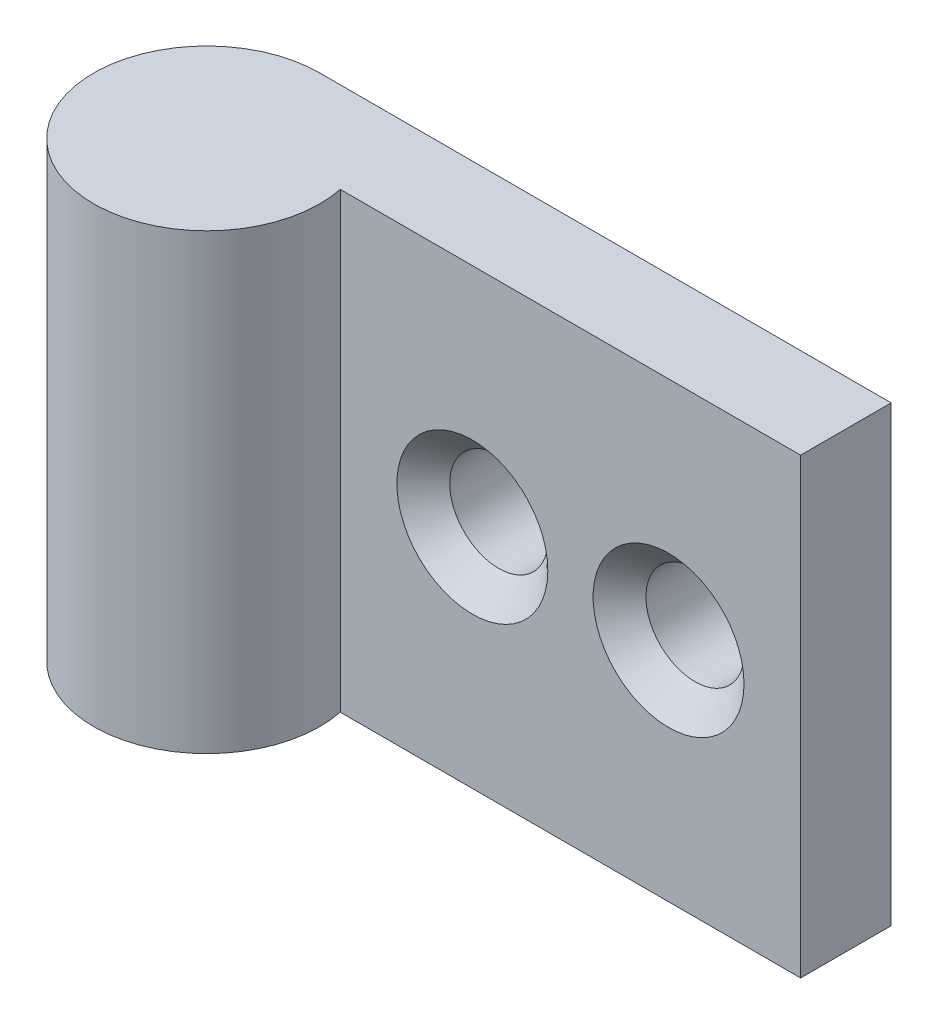
ISO-10303-21;
HEADER;
FILE_DESCRIPTION(('STEP AP214'),'2;1');
FILE_NAME('part.step','',(''),(''),'','','');
FILE_SCHEMA(('AUTOMOTIVE_DESIGN { 1 0 10303 214 1 1 1 1 }'));
ENDSEC;
DATA;
#1=APPLICATION_CONTEXT('core data for automotive mechanical design processes');
#2=APPLICATION_PROTOCOL_DEFINITION('international standard','automotive_design',2000,#1);
#3=PRODUCT_CONTEXT('',#1,'mechanical');
#4=PRODUCT('Part','Part','',(#3));
#5=PRODUCT_RELATED_PRODUCT_CATEGORY('part','',(#4));
#6=PRODUCT_DEFINITION_FORMATION('','',#4);
#7=PRODUCT_DEFINITION_CONTEXT('part definition',#1,'design');
#8=PRODUCT_DEFINITION('design','',#6,#7);
#9=PRODUCT_DEFINITION_SHAPE('','',#8);
#10=(LENGTH_UNIT() NAMED_UNIT(*) SI_UNIT(.MILLI.,.METRE.));
#11=(NAMED_UNIT(*) PLANE_ANGLE_UNIT() SI_UNIT($,.RADIAN.));
#12=(NAMED_UNIT(*) SI_UNIT($,.STERADIAN.) SOLID_ANGLE_UNIT());
#13=UNCERTAINTY_MEASURE_WITH_UNIT(LENGTH_MEASURE(1.E-05),#10,'distance_accuracy_value','');
#14=(GEOMETRIC_REPRESENTATION_CONTEXT(3) GLOBAL_UNCERTAINTY_ASSIGNED_CONTEXT((#13)) GLOBAL_UNIT_ASSIGNED_CONTEXT((#10,
#11,#12)) REPRESENTATION_CONTEXT('',''));
#15=CARTESIAN_POINT('',(0.,0.,0.));
#16=DIRECTION('',(0.,0.,1.));
#17=DIRECTION('',(1.,0.,0.));
#18=AXIS2_PLACEMENT_3D('',#15,#16,#17);
#19=CARTESIAN_POINT('',(30.5,-30.,6.));
#20=DIRECTION('',(0.,1.,0.));
#21=DIRECTION('',(0.,0.,1.));
#22=AXIS2_PLACEMENT_3D('',#19,#20,#21);
#23=PLANE('',#22);
#24=DIRECTION('',(1.,0.,0.));
#25=VECTOR('',#24,1.);
#26=CARTESIAN_POINT('',(30.5,-30.,0.));
#27=LINE('',#26,#25);
#28=CARTESIAN_POINT('',(-7.34846922834953,-30.,0.));
#29=VERTEX_POINT('',#28);
#30=CARTESIAN_POINT('',(30.5,-30.,0.));
#31=VERTEX_POINT('',#30);
#32=EDGE_CURVE('E66',#29,#31,#27,.T.);
#33=ORIENTED_EDGE('',*,*,#32,.T.);
#34=DIRECTION('',(0.,0.,-1.));
#35=VECTOR('',#34,1.);
#36=CARTESIAN_POINT('',(30.5,-30.,6.));
#37=LINE('',#36,#35);
#38=CARTESIAN_POINT('',(30.5,-30.,6.));
#39=VERTEX_POINT('',#38);
#40=EDGE_CURVE('E11',#39,#31,#37,.T.);
#41=ORIENTED_EDGE('',*,*,#40,.F.);
#42=DIRECTION('',(1.,0.,0.));
#43=VECTOR('',#42,1.);
#44=CARTESIAN_POINT('',(30.5,-30.,6.));
#45=LINE('',#44,#43);
#46=CARTESIAN_POINT('',(0.,-30.,6.));
#47=VERTEX_POINT('',#46);
#48=EDGE_CURVE('E81',#47,#39,#45,.T.);
#49=ORIENTED_EDGE('',*,*,#48,.F.);
#50=CARTESIAN_POINT('',(-7.34846922834953,-30.,7.5));
#51=DIRECTION('',(0.,-1.,0.));
#52=DIRECTION('',(0.,0.,-1.));
#53=AXIS2_PLACEMENT_3D('',#50,#51,#52);
#54=CIRCLE('',#53,7.5);
#55=EDGE_CURVE('E109',#47,#29,#54,.T.);
#56=ORIENTED_EDGE('',*,*,#55,.T.);
#57=EDGE_LOOP('',(#33,#41,#49,#56));
#58=FACE_BOUND('',#57,.T.);
#59=ADVANCED_FACE('F38',(#58),#23,.F.);
#60=CARTESIAN_POINT('',(30.5,0.,6.));
#61=DIRECTION('',(-1.,0.,0.));
#62=DIRECTION('',(0.,0.,1.));
#63=AXIS2_PLACEMENT_3D('',#60,#61,#62);
#64=PLANE('',#63);
#65=DIRECTION('',(0.,1.,0.));
#66=VECTOR('',#65,1.);
#67=CARTESIAN_POINT('',(30.5,0.,0.));
#68=LINE('',#67,#66);
#69=CARTESIAN_POINT('',(30.5,0.,0.));
#70=VERTEX_POINT('',#69);
#71=EDGE_CURVE('E98',#31,#70,#68,.T.);
#72=ORIENTED_EDGE('',*,*,#71,.T.);
#73=DIRECTION('',(0.,0.,-1.));
#74=VECTOR('',#73,1.);
#75=CARTESIAN_POINT('',(30.5,0.,6.));
#76=LINE('',#75,#74);
#77=CARTESIAN_POINT('',(30.5,0.,6.));
#78=VERTEX_POINT('',#77);
#79=EDGE_CURVE('E46',#78,#70,#76,.T.);
#80=ORIENTED_EDGE('',*,*,#79,.F.);
#81=DIRECTION('',(0.,1.,0.));
#82=VECTOR('',#81,1.);
#83=CARTESIAN_POINT('',(30.5,0.,6.));
#84=LINE('',#83,#82);
#85=EDGE_CURVE('E84',#39,#78,#84,.T.);
#86=ORIENTED_EDGE('',*,*,#85,.F.);
#87=ORIENTED_EDGE('',*,*,#40,.T.);
#88=EDGE_LOOP('',(#72,#80,#86,#87));
#89=FACE_BOUND('',#88,.T.);
#90=ADVANCED_FACE('F92',(#89),#64,.F.);
#91=CARTESIAN_POINT('',(0.,0.,6.));
#92=DIRECTION('',(0.,-1.,0.));
#93=DIRECTION('',(0.,0.,-1.));
#94=AXIS2_PLACEMENT_3D('',#91,#92,#93);
#95=PLANE('',#94);
#96=DIRECTION('',(-1.,0.,0.));
#97=VECTOR('',#96,1.);
#98=CARTESIAN_POINT('',(0.,0.,0.));
#99=LINE('',#98,#97);
#100=CARTESIAN_POINT('',(-7.34846922834953,0.,0.));
#101=VERTEX_POINT('',#100);
#102=EDGE_CURVE('E75',#70,#101,#99,.T.);
#103=ORIENTED_EDGE('',*,*,#102,.T.);
#104=CARTESIAN_POINT('',(-7.34846922834953,0.,7.5));
#105=DIRECTION('',(0.,-1.,0.));
#106=DIRECTION('',(0.,0.,-1.));
#107=AXIS2_PLACEMENT_3D('',#104,#105,#106);
#108=CIRCLE('',#107,7.5);
#109=CARTESIAN_POINT('',(0.,0.,6.));
#110=VERTEX_POINT('',#109);
#111=EDGE_CURVE('E108',#101,#110,#108,.F.);
#112=ORIENTED_EDGE('',*,*,#111,.T.);
#113=DIRECTION('',(-1.,0.,0.));
#114=VECTOR('',#113,1.);
#115=CARTESIAN_POINT('',(0.,0.,6.));
#116=LINE('',#115,#114);
#117=EDGE_CURVE('E54',#78,#110,#116,.T.);
#118=ORIENTED_EDGE('',*,*,#117,.F.);
#119=ORIENTED_EDGE('',*,*,#79,.T.);
#120=EDGE_LOOP('',(#103,#112,#118,#119));
#121=FACE_BOUND('',#120,.T.);
#122=ADVANCED_FACE('F101',(#121),#95,.F.);
#123=CARTESIAN_POINT('',(0.,0.,6.));
#124=DIRECTION('',(0.,0.,-1.));
#125=DIRECTION('',(-1.,0.,0.));
#126=AXIS2_PLACEMENT_3D('',#123,#124,#125);
#127=PLANE('',#126);
#128=CARTESIAN_POINT('',(8.75000000000001,-15.,6.));
#129=DIRECTION('',(0.,0.,1.));
#130=DIRECTION('',(1.,0.,0.));
#131=AXIS2_PLACEMENT_3D('',#128,#129,#130);
#132=CIRCLE('',#131,5.);
#133=CARTESIAN_POINT('',(13.75,-15.,6.));
#134=VERTEX_POINT('',#133);
#135=EDGE_CURVE('E111',#134,#134,#132,.T.);
#136=ORIENTED_EDGE('',*,*,#135,.F.);
#137=EDGE_LOOP('',(#136));
#138=FACE_BOUND('',#137,.T.);
#139=CARTESIAN_POINT('',(21.75,-15.,6.));
#140=DIRECTION('',(0.,0.,1.));
#141=DIRECTION('',(1.,0.,0.));
#142=AXIS2_PLACEMENT_3D('',#139,#140,#141);
#143=CIRCLE('',#142,5.);
#144=CARTESIAN_POINT('',(26.75,-15.,6.));
#145=VERTEX_POINT('',#144);
#146=EDGE_CURVE('E123',#145,#145,#143,.T.);
#147=ORIENTED_EDGE('',*,*,#146,.F.);
#148=EDGE_LOOP('',(#147));
#149=FACE_BOUND('',#148,.T.);
#150=DIRECTION('',(0.,-1.,0.));
#151=VECTOR('',#150,1.);
#152=CARTESIAN_POINT('',(0.,-30.,6.));
#153=LINE('',#152,#151);
#154=EDGE_CURVE('E87',#110,#47,#153,.T.);
#155=ORIENTED_EDGE('',*,*,#154,.T.);
#156=ORIENTED_EDGE('',*,*,#48,.T.);
#157=ORIENTED_EDGE('',*,*,#85,.T.);
#158=ORIENTED_EDGE('',*,*,#117,.T.);
#159=EDGE_LOOP('',(#155,#156,#157,#158));
#160=FACE_BOUND('',#159,.T.);
#161=ADVANCED_FACE('F82',(#138,#149,#160),#127,.F.);
#162=CARTESIAN_POINT('',(0.,0.,0.));
#163=DIRECTION('',(0.,0.,-1.));
#164=DIRECTION('',(-1.,0.,0.));
#165=AXIS2_PLACEMENT_3D('',#162,#163,#164);
#166=PLANE('',#165);
#167=CARTESIAN_POINT('',(8.75000000000001,-15.,0.));
#168=DIRECTION('',(0.,0.,1.));
#169=DIRECTION('',(1.,0.,0.));
#170=AXIS2_PLACEMENT_3D('',#167,#168,#169);
#171=CIRCLE('',#170,3.25);
#172=CARTESIAN_POINT('',(12.,-15.,0.));
#173=VERTEX_POINT('',#172);
#174=EDGE_CURVE('E120',#173,#173,#171,.T.);
#175=ORIENTED_EDGE('',*,*,#174,.T.);
#176=EDGE_LOOP('',(#175));
#177=FACE_BOUND('',#176,.T.);
#178=CARTESIAN_POINT('',(21.75,-15.,0.));
#179=DIRECTION('',(0.,0.,1.));
#180=DIRECTION('',(1.,0.,0.));
#181=AXIS2_PLACEMENT_3D('',#178,#179,#180);
#182=CIRCLE('',#181,3.25);
#183=CARTESIAN_POINT('',(25.,-15.,0.));
#184=VERTEX_POINT('',#183);
#185=EDGE_CURVE('E99',#184,#184,#182,.T.);
#186=ORIENTED_EDGE('',*,*,#185,.T.);
#187=EDGE_LOOP('',(#186));
#188=FACE_BOUND('',#187,.T.);
#189=ORIENTED_EDGE('',*,*,#32,.F.);
#190=DIRECTION('',(0.,-1.,0.));
#191=VECTOR('',#190,1.);
#192=CARTESIAN_POINT('',(-7.34846922834953,21.2132034355964,0.));
#193=LINE('',#192,#191);
#194=EDGE_CURVE('E106',#101,#29,#193,.T.);
#195=ORIENTED_EDGE('',*,*,#194,.F.);
#196=ORIENTED_EDGE('',*,*,#102,.F.);
#197=ORIENTED_EDGE('',*,*,#71,.F.);
#198=EDGE_LOOP('',(#189,#195,#196,#197));
#199=FACE_BOUND('',#198,.T.);
#200=ADVANCED_FACE('F104',(#177,#188,#199),#166,.T.);
#201=CARTESIAN_POINT('',(21.75,-15.,6.));
#202=DIRECTION('',(0.,0.,1.));
#203=DIRECTION('',(1.,0.,0.));
#204=AXIS2_PLACEMENT_3D('',#201,#202,#203);
#205=CYLINDRICAL_SURFACE('',#204,3.25);
#206=ORIENTED_EDGE('',*,*,#185,.F.);
#207=EDGE_LOOP('',(#206));
#208=FACE_BOUND('',#207,.T.);
#209=CARTESIAN_POINT('',(21.75,-15.,4.25));
#210=DIRECTION('',(0.,0.,1.));
#211=DIRECTION('',(1.,0.,0.));
#212=AXIS2_PLACEMENT_3D('',#209,#210,#211);
#213=CIRCLE('',#212,3.25);
#214=CARTESIAN_POINT('',(25.,-15.,4.25));
#215=VERTEX_POINT('',#214);
#216=EDGE_CURVE('E126',#215,#215,#213,.T.);
#217=ORIENTED_EDGE('',*,*,#216,.T.);
#218=EDGE_LOOP('',(#217));
#219=FACE_BOUND('',#218,.T.);
#220=ADVANCED_FACE('F133',(#208,#219),#205,.F.);
#221=CARTESIAN_POINT('',(21.75,-15.,6.));
#222=DIRECTION('',(0.,0.,1.));
#223=DIRECTION('',(1.,0.,0.));
#224=AXIS2_PLACEMENT_3D('',#221,#222,#223);
#225=CONICAL_SURFACE('',#224,5.,0.78539816339745);
#226=ORIENTED_EDGE('',*,*,#216,.F.);
#227=EDGE_LOOP('',(#226));
#228=FACE_BOUND('',#227,.T.);
#229=ORIENTED_EDGE('',*,*,#146,.T.);
#230=EDGE_LOOP('',(#229));
#231=FACE_BOUND('',#230,.T.);
#232=ADVANCED_FACE('F136',(#228,#231),#225,.F.);
#233=CARTESIAN_POINT('',(8.75000000000001,-15.,6.));
#234=DIRECTION('',(0.,0.,1.));
#235=DIRECTION('',(1.,0.,0.));
#236=AXIS2_PLACEMENT_3D('',#233,#234,#235);
#237=CYLINDRICAL_SURFACE('',#236,3.25);
#238=ORIENTED_EDGE('',*,*,#174,.F.);
#239=EDGE_LOOP('',(#238));
#240=FACE_BOUND('',#239,.T.);
#241=CARTESIAN_POINT('',(8.75000000000001,-15.,4.25));
#242=DIRECTION('',(0.,0.,1.));
#243=DIRECTION('',(1.,0.,0.));
#244=AXIS2_PLACEMENT_3D('',#241,#242,#243);
#245=CIRCLE('',#244,3.25);
#246=CARTESIAN_POINT('',(12.,-15.,4.25));
#247=VERTEX_POINT('',#246);
#248=EDGE_CURVE('E117',#247,#247,#245,.T.);
#249=ORIENTED_EDGE('',*,*,#248,.T.);
#250=EDGE_LOOP('',(#249));
#251=FACE_BOUND('',#250,.T.);
#252=ADVANCED_FACE('F142',(#240,#251),#237,.F.);
#253=CARTESIAN_POINT('',(8.75000000000001,-15.,6.));
#254=DIRECTION('',(0.,0.,1.));
#255=DIRECTION('',(1.,0.,0.));
#256=AXIS2_PLACEMENT_3D('',#253,#254,#255);
#257=CONICAL_SURFACE('',#256,5.,0.78539816339745);
#258=ORIENTED_EDGE('',*,*,#248,.F.);
#259=EDGE_LOOP('',(#258));
#260=FACE_BOUND('',#259,.T.);
#261=ORIENTED_EDGE('',*,*,#135,.T.);
#262=EDGE_LOOP('',(#261));
#263=FACE_BOUND('',#262,.T.);
#264=ADVANCED_FACE('F192',(#260,#263),#257,.F.);
#265=CARTESIAN_POINT('',(-7.34846922834953,21.2132034355964,7.5));
#266=DIRECTION('',(0.,-1.,0.));
#267=DIRECTION('',(0.,0.,-1.));
#268=AXIS2_PLACEMENT_3D('',#265,#266,#267);
#269=CYLINDRICAL_SURFACE('',#268,7.5);
#270=ORIENTED_EDGE('',*,*,#111,.F.);
#271=ORIENTED_EDGE('',*,*,#194,.T.);
#272=ORIENTED_EDGE('',*,*,#55,.F.);
#273=ORIENTED_EDGE('',*,*,#154,.F.);
#274=EDGE_LOOP('',(#270,#271,#272,#273));
#275=FACE_BOUND('',#274,.T.);
#276=ADVANCED_FACE('F189',(#275),#269,.T.);
#277=CLOSED_SHELL('',(#59,#90,#122,#161,#200,#220,#232,#252,#264,#276));
#278=MANIFOLD_SOLID_BREP('B2',#277);
#279=ADVANCED_BREP_SHAPE_REPRESENTATION('',(#18,#278),#14);
#280=SHAPE_DEFINITION_REPRESENTATION(#9,#279);
ENDSEC;
END-ISO-10303-21;
